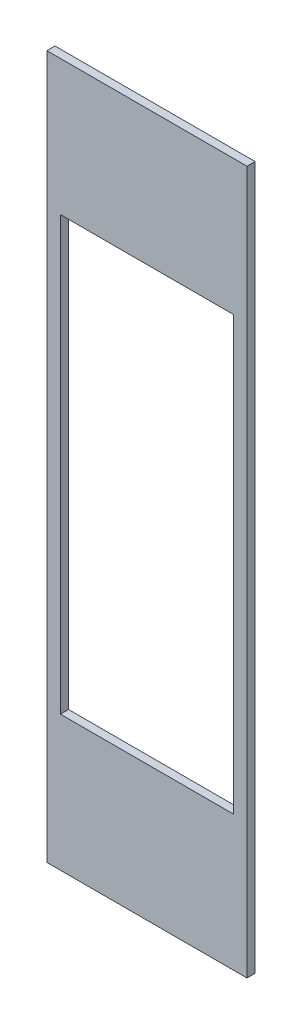
ISO-10303-21;
HEADER;
FILE_DESCRIPTION(('STEP AP214'),'2;1');
FILE_NAME('part.step','',(''),(''),'','','');
FILE_SCHEMA(('AUTOMOTIVE_DESIGN { 1 0 10303 214 1 1 1 1 }'));
ENDSEC;
DATA;
#1=APPLICATION_CONTEXT('core data for automotive mechanical design processes');
#2=APPLICATION_PROTOCOL_DEFINITION('international standard','automotive_design',2000,#1);
#3=PRODUCT_CONTEXT('',#1,'mechanical');
#4=PRODUCT('Part','Part','',(#3));
#5=PRODUCT_RELATED_PRODUCT_CATEGORY('part','',(#4));
#6=PRODUCT_DEFINITION_FORMATION('','',#4);
#7=PRODUCT_DEFINITION_CONTEXT('part definition',#1,'design');
#8=PRODUCT_DEFINITION('design','',#6,#7);
#9=PRODUCT_DEFINITION_SHAPE('','',#8);
#10=(LENGTH_UNIT() NAMED_UNIT(*) SI_UNIT(.MILLI.,.METRE.));
#11=(NAMED_UNIT(*) PLANE_ANGLE_UNIT() SI_UNIT($,.RADIAN.));
#12=(NAMED_UNIT(*) SI_UNIT($,.STERADIAN.) SOLID_ANGLE_UNIT());
#13=UNCERTAINTY_MEASURE_WITH_UNIT(LENGTH_MEASURE(1.E-05),#10,'distance_accuracy_value','');
#14=(GEOMETRIC_REPRESENTATION_CONTEXT(3) GLOBAL_UNCERTAINTY_ASSIGNED_CONTEXT((#13)) GLOBAL_UNIT_ASSIGNED_CONTEXT((#10,
#11,#12)) REPRESENTATION_CONTEXT('',''));
#15=CARTESIAN_POINT('',(0.,0.,0.));
#16=DIRECTION('',(0.,0.,1.));
#17=DIRECTION('',(1.,0.,0.));
#18=AXIS2_PLACEMENT_3D('',#15,#16,#17);
#19=CARTESIAN_POINT('',(185.,650.,15.));
#20=DIRECTION('',(-1.,0.,0.));
#21=DIRECTION('',(0.,-1.,0.));
#22=AXIS2_PLACEMENT_3D('',#19,#20,#21);
#23=PLANE('',#22);
#24=DIRECTION('',(0.,1.,0.));
#25=VECTOR('',#24,1.);
#26=CARTESIAN_POINT('',(185.,650.,0.));
#27=LINE('',#26,#25);
#28=CARTESIAN_POINT('',(185.,-650.,0.));
#29=VERTEX_POINT('',#28);
#30=CARTESIAN_POINT('',(185.,650.,0.));
#31=VERTEX_POINT('',#30);
#32=EDGE_CURVE('E146',#29,#31,#27,.T.);
#33=ORIENTED_EDGE('',*,*,#32,.T.);
#34=DIRECTION('',(0.,0.,-1.));
#35=VECTOR('',#34,1.);
#36=CARTESIAN_POINT('',(185.,650.,15.));
#37=LINE('',#36,#35);
#38=CARTESIAN_POINT('',(185.,650.,15.));
#39=VERTEX_POINT('',#38);
#40=EDGE_CURVE('E11',#39,#31,#37,.T.);
#41=ORIENTED_EDGE('',*,*,#40,.F.);
#42=DIRECTION('',(0.,1.,0.));
#43=VECTOR('',#42,1.);
#44=CARTESIAN_POINT('',(185.,650.,15.));
#45=LINE('',#44,#43);
#46=CARTESIAN_POINT('',(185.,-650.,15.));
#47=VERTEX_POINT('',#46);
#48=EDGE_CURVE('E152',#47,#39,#45,.T.);
#49=ORIENTED_EDGE('',*,*,#48,.F.);
#50=DIRECTION('',(0.,0.,-1.));
#51=VECTOR('',#50,1.);
#52=CARTESIAN_POINT('',(185.,-650.,15.));
#53=LINE('',#52,#51);
#54=EDGE_CURVE('E166',#47,#29,#53,.T.);
#55=ORIENTED_EDGE('',*,*,#54,.T.);
#56=EDGE_LOOP('',(#33,#41,#49,#55));
#57=FACE_BOUND('',#56,.T.);
#58=ADVANCED_FACE('F38',(#57),#23,.F.);
#59=CARTESIAN_POINT('',(-185.,650.,15.));
#60=DIRECTION('',(0.,-1.,0.));
#61=DIRECTION('',(0.,0.,-1.));
#62=AXIS2_PLACEMENT_3D('',#59,#60,#61);
#63=PLANE('',#62);
#64=DIRECTION('',(-1.,0.,0.));
#65=VECTOR('',#64,1.);
#66=CARTESIAN_POINT('',(-185.,650.,0.));
#67=LINE('',#66,#65);
#68=CARTESIAN_POINT('',(-185.,650.,0.));
#69=VERTEX_POINT('',#68);
#70=EDGE_CURVE('E170',#31,#69,#67,.T.);
#71=ORIENTED_EDGE('',*,*,#70,.T.);
#72=DIRECTION('',(0.,0.,-1.));
#73=VECTOR('',#72,1.);
#74=CARTESIAN_POINT('',(-185.,650.,15.));
#75=LINE('',#74,#73);
#76=CARTESIAN_POINT('',(-185.,650.,15.));
#77=VERTEX_POINT('',#76);
#78=EDGE_CURVE('E46',#77,#69,#75,.T.);
#79=ORIENTED_EDGE('',*,*,#78,.F.);
#80=DIRECTION('',(-1.,0.,0.));
#81=VECTOR('',#80,1.);
#82=CARTESIAN_POINT('',(-185.,650.,15.));
#83=LINE('',#82,#81);
#84=EDGE_CURVE('E156',#39,#77,#83,.T.);
#85=ORIENTED_EDGE('',*,*,#84,.F.);
#86=ORIENTED_EDGE('',*,*,#40,.T.);
#87=EDGE_LOOP('',(#71,#79,#85,#86));
#88=FACE_BOUND('',#87,.T.);
#89=ADVANCED_FACE('F204',(#88),#63,.F.);
#90=CARTESIAN_POINT('',(-185.,650.,15.));
#91=DIRECTION('',(1.,0.,0.));
#92=DIRECTION('',(0.,1.,0.));
#93=AXIS2_PLACEMENT_3D('',#90,#91,#92);
#94=PLANE('',#93);
#95=DIRECTION('',(0.,-1.,0.));
#96=VECTOR('',#95,1.);
#97=CARTESIAN_POINT('',(-185.,650.,0.));
#98=LINE('',#97,#96);
#99=CARTESIAN_POINT('',(-185.,-650.,0.));
#100=VERTEX_POINT('',#99);
#101=EDGE_CURVE('E173',#69,#100,#98,.T.);
#102=ORIENTED_EDGE('',*,*,#101,.T.);
#103=DIRECTION('',(0.,0.,-1.));
#104=VECTOR('',#103,1.);
#105=CARTESIAN_POINT('',(-185.,-650.,15.));
#106=LINE('',#105,#104);
#107=CARTESIAN_POINT('',(-185.,-650.,15.));
#108=VERTEX_POINT('',#107);
#109=EDGE_CURVE('E181',#108,#100,#106,.T.);
#110=ORIENTED_EDGE('',*,*,#109,.F.);
#111=DIRECTION('',(0.,-1.,0.));
#112=VECTOR('',#111,1.);
#113=CARTESIAN_POINT('',(-185.,650.,15.));
#114=LINE('',#113,#112);
#115=EDGE_CURVE('E160',#77,#108,#114,.T.);
#116=ORIENTED_EDGE('',*,*,#115,.F.);
#117=ORIENTED_EDGE('',*,*,#78,.T.);
#118=EDGE_LOOP('',(#102,#110,#116,#117));
#119=FACE_BOUND('',#118,.T.);
#120=ADVANCED_FACE('F190',(#119),#94,.F.);
#121=CARTESIAN_POINT('',(-185.,-650.,15.));
#122=DIRECTION('',(0.,1.,0.));
#123=DIRECTION('',(0.,0.,1.));
#124=AXIS2_PLACEMENT_3D('',#121,#122,#123);
#125=PLANE('',#124);
#126=DIRECTION('',(1.,0.,0.));
#127=VECTOR('',#126,1.);
#128=CARTESIAN_POINT('',(-185.,-650.,0.));
#129=LINE('',#128,#127);
#130=EDGE_CURVE('E157',#100,#29,#129,.T.);
#131=ORIENTED_EDGE('',*,*,#130,.T.);
#132=ORIENTED_EDGE('',*,*,#54,.F.);
#133=DIRECTION('',(1.,0.,0.));
#134=VECTOR('',#133,1.);
#135=CARTESIAN_POINT('',(-185.,-650.,15.));
#136=LINE('',#135,#134);
#137=EDGE_CURVE('E163',#108,#47,#136,.T.);
#138=ORIENTED_EDGE('',*,*,#137,.F.);
#139=ORIENTED_EDGE('',*,*,#109,.T.);
#140=EDGE_LOOP('',(#131,#132,#138,#139));
#141=FACE_BOUND('',#140,.T.);
#142=ADVANCED_FACE('F197',(#141),#125,.F.);
#143=CARTESIAN_POINT('',(0.,0.,15.));
#144=DIRECTION('',(0.,0.,1.));
#145=DIRECTION('',(1.,0.,0.));
#146=AXIS2_PLACEMENT_3D('',#143,#144,#145);
#147=PLANE('',#146);
#148=DIRECTION('',(0.,1.,0.));
#149=VECTOR('',#148,1.);
#150=CARTESIAN_POINT('',(160.,400.,15.));
#151=LINE('',#150,#149);
#152=CARTESIAN_POINT('',(160.,-400.,15.));
#153=VERTEX_POINT('',#152);
#154=CARTESIAN_POINT('',(160.,400.,15.));
#155=VERTEX_POINT('',#154);
#156=EDGE_CURVE('E53',#153,#155,#151,.T.);
#157=ORIENTED_EDGE('',*,*,#156,.F.);
#158=DIRECTION('',(1.,0.,0.));
#159=VECTOR('',#158,1.);
#160=CARTESIAN_POINT('',(-160.,-400.,15.));
#161=LINE('',#160,#159);
#162=CARTESIAN_POINT('',(-160.,-400.,15.));
#163=VERTEX_POINT('',#162);
#164=EDGE_CURVE('E124',#163,#153,#161,.T.);
#165=ORIENTED_EDGE('',*,*,#164,.F.);
#166=DIRECTION('',(0.,-1.,0.));
#167=VECTOR('',#166,1.);
#168=CARTESIAN_POINT('',(-160.,400.,15.));
#169=LINE('',#168,#167);
#170=CARTESIAN_POINT('',(-160.,400.,15.));
#171=VERTEX_POINT('',#170);
#172=EDGE_CURVE('E128',#171,#163,#169,.T.);
#173=ORIENTED_EDGE('',*,*,#172,.F.);
#174=DIRECTION('',(-1.,0.,0.));
#175=VECTOR('',#174,1.);
#176=CARTESIAN_POINT('',(-160.,400.,15.));
#177=LINE('',#176,#175);
#178=EDGE_CURVE('E137',#155,#171,#177,.T.);
#179=ORIENTED_EDGE('',*,*,#178,.F.);
#180=EDGE_LOOP('',(#157,#165,#173,#179));
#181=FACE_BOUND('',#180,.T.);
#182=ORIENTED_EDGE('',*,*,#48,.T.);
#183=ORIENTED_EDGE('',*,*,#84,.T.);
#184=ORIENTED_EDGE('',*,*,#115,.T.);
#185=ORIENTED_EDGE('',*,*,#137,.T.);
#186=EDGE_LOOP('',(#182,#183,#184,#185));
#187=FACE_BOUND('',#186,.T.);
#188=ADVANCED_FACE('F203',(#181,#187),#147,.T.);
#189=CARTESIAN_POINT('',(0.,0.,0.));
#190=DIRECTION('',(0.,0.,1.));
#191=DIRECTION('',(1.,0.,0.));
#192=AXIS2_PLACEMENT_3D('',#189,#190,#191);
#193=PLANE('',#192);
#194=DIRECTION('',(1.,0.,0.));
#195=VECTOR('',#194,1.);
#196=CARTESIAN_POINT('',(-160.,-400.,0.));
#197=LINE('',#196,#195);
#198=CARTESIAN_POINT('',(-160.,-400.,0.));
#199=VERTEX_POINT('',#198);
#200=CARTESIAN_POINT('',(160.,-400.,0.));
#201=VERTEX_POINT('',#200);
#202=EDGE_CURVE('E112',#199,#201,#197,.T.);
#203=ORIENTED_EDGE('',*,*,#202,.T.);
#204=DIRECTION('',(0.,1.,0.));
#205=VECTOR('',#204,1.);
#206=CARTESIAN_POINT('',(160.,400.,0.));
#207=LINE('',#206,#205);
#208=CARTESIAN_POINT('',(160.,400.,0.));
#209=VERTEX_POINT('',#208);
#210=EDGE_CURVE('E105',#201,#209,#207,.T.);
#211=ORIENTED_EDGE('',*,*,#210,.T.);
#212=DIRECTION('',(-1.,0.,0.));
#213=VECTOR('',#212,1.);
#214=CARTESIAN_POINT('',(-160.,400.,0.));
#215=LINE('',#214,#213);
#216=CARTESIAN_POINT('',(-160.,400.,0.));
#217=VERTEX_POINT('',#216);
#218=EDGE_CURVE('E115',#209,#217,#215,.T.);
#219=ORIENTED_EDGE('',*,*,#218,.T.);
#220=DIRECTION('',(0.,-1.,0.));
#221=VECTOR('',#220,1.);
#222=CARTESIAN_POINT('',(-160.,400.,0.));
#223=LINE('',#222,#221);
#224=EDGE_CURVE('E61',#217,#199,#223,.T.);
#225=ORIENTED_EDGE('',*,*,#224,.T.);
#226=EDGE_LOOP('',(#203,#211,#219,#225));
#227=FACE_BOUND('',#226,.T.);
#228=ORIENTED_EDGE('',*,*,#32,.F.);
#229=ORIENTED_EDGE('',*,*,#130,.F.);
#230=ORIENTED_EDGE('',*,*,#101,.F.);
#231=ORIENTED_EDGE('',*,*,#70,.F.);
#232=EDGE_LOOP('',(#228,#229,#230,#231));
#233=FACE_BOUND('',#232,.T.);
#234=ADVANCED_FACE('F120',(#227,#233),#193,.F.);
#235=CARTESIAN_POINT('',(160.,400.,0.));
#236=DIRECTION('',(1.,0.,0.));
#237=DIRECTION('',(0.,1.,0.));
#238=AXIS2_PLACEMENT_3D('',#235,#236,#237);
#239=PLANE('',#238);
#240=ORIENTED_EDGE('',*,*,#156,.T.);
#241=DIRECTION('',(0.,0.,1.));
#242=VECTOR('',#241,1.);
#243=CARTESIAN_POINT('',(160.,400.,0.));
#244=LINE('',#243,#242);
#245=EDGE_CURVE('E101',#209,#155,#244,.T.);
#246=ORIENTED_EDGE('',*,*,#245,.F.);
#247=ORIENTED_EDGE('',*,*,#210,.F.);
#248=DIRECTION('',(0.,0.,1.));
#249=VECTOR('',#248,1.);
#250=CARTESIAN_POINT('',(160.,-400.,0.));
#251=LINE('',#250,#249);
#252=EDGE_CURVE('E143',#201,#153,#251,.T.);
#253=ORIENTED_EDGE('',*,*,#252,.T.);
#254=EDGE_LOOP('',(#240,#246,#247,#253));
#255=FACE_BOUND('',#254,.T.);
#256=ADVANCED_FACE('F103',(#255),#239,.F.);
#257=CARTESIAN_POINT('',(-160.,-400.,0.));
#258=DIRECTION('',(0.,-1.,0.));
#259=DIRECTION('',(0.,0.,-1.));
#260=AXIS2_PLACEMENT_3D('',#257,#258,#259);
#261=PLANE('',#260);
#262=ORIENTED_EDGE('',*,*,#164,.T.);
#263=ORIENTED_EDGE('',*,*,#252,.F.);
#264=ORIENTED_EDGE('',*,*,#202,.F.);
#265=DIRECTION('',(0.,0.,1.));
#266=VECTOR('',#265,1.);
#267=CARTESIAN_POINT('',(-160.,-400.,0.));
#268=LINE('',#267,#266);
#269=EDGE_CURVE('E147',#199,#163,#268,.T.);
#270=ORIENTED_EDGE('',*,*,#269,.T.);
#271=EDGE_LOOP('',(#262,#263,#264,#270));
#272=FACE_BOUND('',#271,.T.);
#273=ADVANCED_FACE('F221',(#272),#261,.F.);
#274=CARTESIAN_POINT('',(-160.,400.,0.));
#275=DIRECTION('',(-1.,0.,0.));
#276=DIRECTION('',(0.,-1.,0.));
#277=AXIS2_PLACEMENT_3D('',#274,#275,#276);
#278=PLANE('',#277);
#279=ORIENTED_EDGE('',*,*,#172,.T.);
#280=ORIENTED_EDGE('',*,*,#269,.F.);
#281=ORIENTED_EDGE('',*,*,#224,.F.);
#282=DIRECTION('',(0.,0.,1.));
#283=VECTOR('',#282,1.);
#284=CARTESIAN_POINT('',(-160.,400.,0.));
#285=LINE('',#284,#283);
#286=EDGE_CURVE('E111',#217,#171,#285,.T.);
#287=ORIENTED_EDGE('',*,*,#286,.T.);
#288=EDGE_LOOP('',(#279,#280,#281,#287));
#289=FACE_BOUND('',#288,.T.);
#290=ADVANCED_FACE('F224',(#289),#278,.F.);
#291=CARTESIAN_POINT('',(-160.,400.,0.));
#292=DIRECTION('',(0.,1.,0.));
#293=DIRECTION('',(0.,0.,1.));
#294=AXIS2_PLACEMENT_3D('',#291,#292,#293);
#295=PLANE('',#294);
#296=ORIENTED_EDGE('',*,*,#178,.T.);
#297=ORIENTED_EDGE('',*,*,#286,.F.);
#298=ORIENTED_EDGE('',*,*,#218,.F.);
#299=ORIENTED_EDGE('',*,*,#245,.T.);
#300=EDGE_LOOP('',(#296,#297,#298,#299));
#301=FACE_BOUND('',#300,.T.);
#302=ADVANCED_FACE('F116',(#301),#295,.F.);
#303=CLOSED_SHELL('',(#58,#89,#120,#142,#188,#234,#256,#273,#290,#302));
#304=MANIFOLD_SOLID_BREP('B2',#303);
#305=ADVANCED_BREP_SHAPE_REPRESENTATION('',(#18,#304),#14);
#306=SHAPE_DEFINITION_REPRESENTATION(#9,#305);
ENDSEC;
END-ISO-10303-21;
